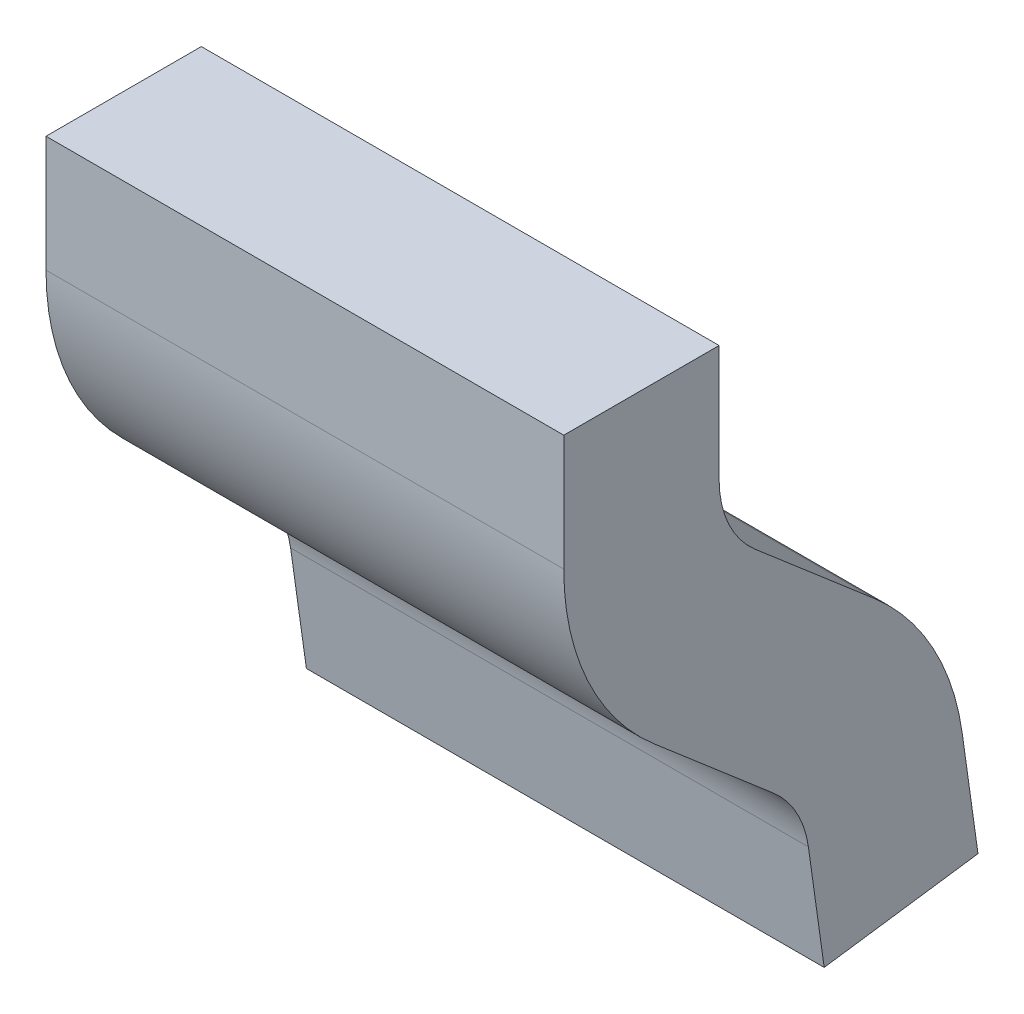
ISO-10303-21;
HEADER;
FILE_DESCRIPTION(('STEP AP214'),'2;1');
FILE_NAME('part.step','',(''),(''),'','','');
FILE_SCHEMA(('AUTOMOTIVE_DESIGN { 1 0 10303 214 1 1 1 1 }'));
ENDSEC;
DATA;
#1=APPLICATION_CONTEXT('core data for automotive mechanical design processes');
#2=APPLICATION_PROTOCOL_DEFINITION('international standard','automotive_design',2000,#1);
#3=PRODUCT_CONTEXT('',#1,'mechanical');
#4=PRODUCT('Part','Part','',(#3));
#5=PRODUCT_RELATED_PRODUCT_CATEGORY('part','',(#4));
#6=PRODUCT_DEFINITION_FORMATION('','',#4);
#7=PRODUCT_DEFINITION_CONTEXT('part definition',#1,'design');
#8=PRODUCT_DEFINITION('design','',#6,#7);
#9=PRODUCT_DEFINITION_SHAPE('','',#8);
#10=(LENGTH_UNIT() NAMED_UNIT(*) SI_UNIT(.MILLI.,.METRE.));
#11=(NAMED_UNIT(*) PLANE_ANGLE_UNIT() SI_UNIT($,.RADIAN.));
#12=(NAMED_UNIT(*) SI_UNIT($,.STERADIAN.) SOLID_ANGLE_UNIT());
#13=UNCERTAINTY_MEASURE_WITH_UNIT(LENGTH_MEASURE(1.E-05),#10,'distance_accuracy_value','');
#14=(GEOMETRIC_REPRESENTATION_CONTEXT(3) GLOBAL_UNCERTAINTY_ASSIGNED_CONTEXT((#13)) GLOBAL_UNIT_ASSIGNED_CONTEXT((#10,
#11,#12)) REPRESENTATION_CONTEXT('',''));
#15=CARTESIAN_POINT('',(0.,0.,0.));
#16=DIRECTION('',(0.,0.,1.));
#17=DIRECTION('',(1.,0.,0.));
#18=AXIS2_PLACEMENT_3D('',#15,#16,#17);
#19=CARTESIAN_POINT('',(0.5,-0.02087596514401,0.148540210311));
#20=DIRECTION('',(0.,0.990268068741588,0.139173100959942));
#21=DIRECTION('',(0.,-0.139173100959942,0.990268068741588));
#22=AXIS2_PLACEMENT_3D('',#19,#20,#21);
#23=PLANE('',#22);
#24=DIRECTION('',(0.,0.139173100960282,-0.99026806874154));
#25=VECTOR('',#24,1.);
#26=CARTESIAN_POINT('',(0.5,-0.02087596514401,0.148540210311));
#27=LINE('',#26,#25);
#28=CARTESIAN_POINT('',(0.5,-0.0208759651440416,0.148540210311224));
#29=VERTEX_POINT('',#28);
#30=CARTESIAN_POINT('',(0.5,0.,0.));
#31=VERTEX_POINT('',#30);
#32=EDGE_CURVE('E159',#29,#31,#27,.T.);
#33=ORIENTED_EDGE('',*,*,#32,.F.);
#34=DIRECTION('',(1.,0.,0.));
#35=VECTOR('',#34,1.);
#36=CARTESIAN_POINT('',(0.5,-0.0208759651441046,0.148540210311673));
#37=LINE('',#36,#35);
#38=CARTESIAN_POINT('',(0.,-0.0208759651440416,0.148540210311224));
#39=VERTEX_POINT('',#38);
#40=EDGE_CURVE('E109',#29,#39,#37,.F.);
#41=ORIENTED_EDGE('',*,*,#40,.T.);
#42=DIRECTION('',(0.,0.139173100960282,-0.99026806874154));
#43=VECTOR('',#42,1.);
#44=CARTESIAN_POINT('',(0.,-0.02087596514401,0.148540210311));
#45=LINE('',#44,#43);
#46=CARTESIAN_POINT('',(0.,0.,0.));
#47=VERTEX_POINT('',#46);
#48=EDGE_CURVE('E115',#39,#47,#45,.T.);
#49=ORIENTED_EDGE('',*,*,#48,.T.);
#50=DIRECTION('',(1.,0.,0.));
#51=VECTOR('',#50,1.);
#52=CARTESIAN_POINT('',(0.5,0.,0.));
#53=LINE('',#52,#51);
#54=EDGE_CURVE('E149',#47,#31,#53,.T.);
#55=ORIENTED_EDGE('',*,*,#54,.T.);
#56=EDGE_LOOP('',(#33,#41,#49,#55));
#57=FACE_BOUND('',#56,.T.);
#58=ADVANCED_FACE('F17',(#57),#23,.F.);
#59=CARTESIAN_POINT('',(0.5,0.,0.));
#60=DIRECTION('',(0.,-0.139173100959942,0.990268068741588));
#61=DIRECTION('',(0.,-0.990268068741588,-0.139173100959942));
#62=AXIS2_PLACEMENT_3D('',#59,#60,#61);
#63=PLANE('',#62);
#64=DIRECTION('',(0.,0.990268068741645,0.139173100959538));
#65=VECTOR('',#64,1.);
#66=CARTESIAN_POINT('',(0.5,0.,0.));
#67=LINE('',#66,#65);
#68=CARTESIAN_POINT('',(0.5,0.108466835632712,0.0152440196174594));
#69=VERTEX_POINT('',#68);
#70=EDGE_CURVE('E162',#31,#69,#67,.T.);
#71=ORIENTED_EDGE('',*,*,#70,.F.);
#72=ORIENTED_EDGE('',*,*,#54,.F.);
#73=DIRECTION('',(0.,0.990268068741645,0.139173100959538));
#74=VECTOR('',#73,1.);
#75=CARTESIAN_POINT('',(0.,0.,0.));
#76=LINE('',#75,#74);
#77=CARTESIAN_POINT('',(0.,0.108466835632712,0.0152440196174594));
#78=VERTEX_POINT('',#77);
#79=EDGE_CURVE('E118',#47,#78,#76,.T.);
#80=ORIENTED_EDGE('',*,*,#79,.T.);
#81=DIRECTION('',(-1.,0.,0.));
#82=VECTOR('',#81,1.);
#83=CARTESIAN_POINT('',(0.5,0.108466835632953,0.0152440196176632));
#84=LINE('',#83,#82);
#85=EDGE_CURVE('E146',#69,#78,#84,.T.);
#86=ORIENTED_EDGE('',*,*,#85,.F.);
#87=EDGE_LOOP('',(#71,#72,#80,#86));
#88=FACE_BOUND('',#87,.T.);
#89=ADVANCED_FACE('F206',(#88),#63,.F.);
#90=CARTESIAN_POINT('',(0.5,0.07367356039254,0.262811036803));
#91=DIRECTION('',(-1.,0.,0.));
#92=DIRECTION('',(0.,0.,1.));
#93=AXIS2_PLACEMENT_3D('',#90,#91,#92);
#94=CYLINDRICAL_SURFACE('',#93,0.25);
#95=CARTESIAN_POINT('',(0.,0.07367356039254,0.262811036803));
#96=DIRECTION('',(-1.,0.,0.));
#97=DIRECTION('',(0.,0.,1.));
#98=AXIS2_PLACEMENT_3D('',#95,#96,#97);
#99=CIRCLE('',#98,0.25);
#100=CARTESIAN_POINT('',(0.,0.263443889430082,0.100062082222095));
#101=VERTEX_POINT('',#100);
#102=EDGE_CURVE('E173',#78,#101,#99,.F.);
#103=ORIENTED_EDGE('',*,*,#102,.T.);
#104=DIRECTION('',(1.,0.,0.));
#105=VECTOR('',#104,1.);
#106=CARTESIAN_POINT('',(0.5,0.26344388943,0.100062082222));
#107=LINE('',#106,#105);
#108=CARTESIAN_POINT('',(0.5,0.263443889430082,0.100062082222095));
#109=VERTEX_POINT('',#108);
#110=EDGE_CURVE('E144',#101,#109,#107,.T.);
#111=ORIENTED_EDGE('',*,*,#110,.T.);
#112=CARTESIAN_POINT('',(0.5,0.07367356039254,0.262811036803));
#113=DIRECTION('',(-1.,0.,0.));
#114=DIRECTION('',(0.,0.,1.));
#115=AXIS2_PLACEMENT_3D('',#112,#113,#114);
#116=CIRCLE('',#115,0.25);
#117=EDGE_CURVE('E178',#69,#109,#116,.F.);
#118=ORIENTED_EDGE('',*,*,#117,.F.);
#119=ORIENTED_EDGE('',*,*,#85,.T.);
#120=EDGE_LOOP('',(#103,#111,#118,#119));
#121=FACE_BOUND('',#120,.T.);
#122=ADVANCED_FACE('F209',(#121),#94,.T.);
#123=CARTESIAN_POINT('',(0.5,0.26344388943,0.100062082222));
#124=DIRECTION('',(0.,-0.759081316148799,0.650995818322827));
#125=DIRECTION('',(0.,-0.650995818322827,-0.759081316148799));
#126=AXIS2_PLACEMENT_3D('',#123,#124,#125);
#127=PLANE('',#126);
#128=DIRECTION('',(0.,0.650995818322227,0.759081316149314));
#129=VECTOR('',#128,1.);
#130=CARTESIAN_POINT('',(0.5,0.26344388943,0.100062082222));
#131=LINE('',#130,#129);
#132=CARTESIAN_POINT('',(0.5,0.362101213228034,0.215099581832111));
#133=VERTEX_POINT('',#132);
#134=EDGE_CURVE('E177',#109,#133,#131,.T.);
#135=ORIENTED_EDGE('',*,*,#134,.F.);
#136=ORIENTED_EDGE('',*,*,#110,.F.);
#137=DIRECTION('',(0.,0.650995818322227,0.759081316149314));
#138=VECTOR('',#137,1.);
#139=CARTESIAN_POINT('',(0.,0.26344388943,0.100062082222));
#140=LINE('',#139,#138);
#141=CARTESIAN_POINT('',(0.,0.362101213228034,0.215099581832111));
#142=VERTEX_POINT('',#141);
#143=EDGE_CURVE('E172',#101,#142,#140,.T.);
#144=ORIENTED_EDGE('',*,*,#143,.T.);
#145=DIRECTION('',(-1.,0.,0.));
#146=VECTOR('',#145,1.);
#147=CARTESIAN_POINT('',(0.5,0.36210121322793,0.21509958183206));
#148=LINE('',#147,#146);
#149=EDGE_CURVE('E142',#142,#133,#148,.F.);
#150=ORIENTED_EDGE('',*,*,#149,.T.);
#151=EDGE_LOOP('',(#135,#136,#144,#150));
#152=FACE_BOUND('',#151,.T.);
#153=ADVANCED_FACE('F214',(#152),#127,.F.);
#154=CARTESIAN_POINT('',(0.5,0.438009344843,0.15));
#155=DIRECTION('',(-1.,0.,0.));
#156=DIRECTION('',(0.,0.,1.));
#157=AXIS2_PLACEMENT_3D('',#154,#155,#156);
#158=CYLINDRICAL_SURFACE('',#157,0.1);
#159=CARTESIAN_POINT('',(0.5,0.438009344843,0.15));
#160=DIRECTION('',(-1.,0.,0.));
#161=DIRECTION('',(0.,0.,1.));
#162=AXIS2_PLACEMENT_3D('',#159,#160,#161);
#163=CIRCLE('',#162,0.1);
#164=CARTESIAN_POINT('',(0.5,0.438009344843,0.25));
#165=VERTEX_POINT('',#164);
#166=EDGE_CURVE('E175',#133,#165,#163,.T.);
#167=ORIENTED_EDGE('',*,*,#166,.F.);
#168=ORIENTED_EDGE('',*,*,#149,.F.);
#169=CARTESIAN_POINT('',(0.,0.438009344843,0.15));
#170=DIRECTION('',(-1.,0.,0.));
#171=DIRECTION('',(0.,0.,1.));
#172=AXIS2_PLACEMENT_3D('',#169,#170,#171);
#173=CIRCLE('',#172,0.1);
#174=CARTESIAN_POINT('',(0.,0.438009344843,0.25));
#175=VERTEX_POINT('',#174);
#176=EDGE_CURVE('E170',#142,#175,#173,.T.);
#177=ORIENTED_EDGE('',*,*,#176,.T.);
#178=DIRECTION('',(1.,0.,0.));
#179=VECTOR('',#178,1.);
#180=CARTESIAN_POINT('',(0.5,0.438009344843,0.25));
#181=LINE('',#180,#179);
#182=EDGE_CURVE('E138',#175,#165,#181,.T.);
#183=ORIENTED_EDGE('',*,*,#182,.T.);
#184=EDGE_LOOP('',(#167,#168,#177,#183));
#185=FACE_BOUND('',#184,.T.);
#186=ADVANCED_FACE('F220',(#185),#158,.F.);
#187=CARTESIAN_POINT('',(0.5,0.438009344843,0.25));
#188=DIRECTION('',(0.,0.,1.));
#189=DIRECTION('',(1.,0.,0.));
#190=AXIS2_PLACEMENT_3D('',#187,#188,#189);
#191=PLANE('',#190);
#192=DIRECTION('',(0.,1.,0.));
#193=VECTOR('',#192,1.);
#194=CARTESIAN_POINT('',(0.5,0.07367356039254,0.25));
#195=LINE('',#194,#193);
#196=CARTESIAN_POINT('',(0.5,0.55,0.25));
#197=VERTEX_POINT('',#196);
#198=EDGE_CURVE('E156',#165,#197,#195,.T.);
#199=ORIENTED_EDGE('',*,*,#198,.F.);
#200=ORIENTED_EDGE('',*,*,#182,.F.);
#201=DIRECTION('',(0.,1.,0.));
#202=VECTOR('',#201,1.);
#203=CARTESIAN_POINT('',(0.,0.07367356039254,0.25));
#204=LINE('',#203,#202);
#205=CARTESIAN_POINT('',(0.,0.55,0.25));
#206=VERTEX_POINT('',#205);
#207=EDGE_CURVE('E133',#175,#206,#204,.T.);
#208=ORIENTED_EDGE('',*,*,#207,.T.);
#209=DIRECTION('',(1.,0.,0.));
#210=VECTOR('',#209,1.);
#211=CARTESIAN_POINT('',(0.5,0.55,0.25));
#212=LINE('',#211,#210);
#213=EDGE_CURVE('E112',#206,#197,#212,.T.);
#214=ORIENTED_EDGE('',*,*,#213,.T.);
#215=EDGE_LOOP('',(#199,#200,#208,#214));
#216=FACE_BOUND('',#215,.T.);
#217=ADVANCED_FACE('F226',(#216),#191,.F.);
#218=CARTESIAN_POINT('',(0.5,0.55,0.25));
#219=DIRECTION('',(0.,-1.,0.));
#220=DIRECTION('',(0.,0.,-1.));
#221=AXIS2_PLACEMENT_3D('',#218,#219,#220);
#222=PLANE('',#221);
#223=DIRECTION('',(0.,0.,-1.));
#224=VECTOR('',#223,1.);
#225=CARTESIAN_POINT('',(0.5,0.55,0.262811036803));
#226=LINE('',#225,#224);
#227=CARTESIAN_POINT('',(0.5,0.55,0.4));
#228=VERTEX_POINT('',#227);
#229=EDGE_CURVE('E126',#197,#228,#226,.F.);
#230=ORIENTED_EDGE('',*,*,#229,.F.);
#231=ORIENTED_EDGE('',*,*,#213,.F.);
#232=DIRECTION('',(0.,0.,-1.));
#233=VECTOR('',#232,1.);
#234=CARTESIAN_POINT('',(0.,0.55,0.262811036803));
#235=LINE('',#234,#233);
#236=CARTESIAN_POINT('',(0.,0.55,0.4));
#237=VERTEX_POINT('',#236);
#238=EDGE_CURVE('E129',#206,#237,#235,.F.);
#239=ORIENTED_EDGE('',*,*,#238,.T.);
#240=DIRECTION('',(-1.,0.,0.));
#241=VECTOR('',#240,1.);
#242=CARTESIAN_POINT('',(0.5,0.55,0.4));
#243=LINE('',#242,#241);
#244=EDGE_CURVE('E123',#237,#228,#243,.F.);
#245=ORIENTED_EDGE('',*,*,#244,.T.);
#246=EDGE_LOOP('',(#230,#231,#239,#245));
#247=FACE_BOUND('',#246,.T.);
#248=ADVANCED_FACE('F278',(#247),#222,.F.);
#249=CARTESIAN_POINT('',(0.5,0.08759087048855,0.163784229929));
#250=DIRECTION('',(0.,0.139173100959942,-0.990268068741588));
#251=DIRECTION('',(0.,0.990268068741588,0.139173100959942));
#252=AXIS2_PLACEMENT_3D('',#249,#250,#251);
#253=PLANE('',#252);
#254=DIRECTION('',(0.,-0.990268068740724,-0.13917310096609));
#255=VECTOR('',#254,1.);
#256=CARTESIAN_POINT('',(0.5,0.08759087048855,0.163784229929));
#257=LINE('',#256,#255);
#258=CARTESIAN_POINT('',(0.5,0.0875908704888495,0.163784229928964));
#259=VERTEX_POINT('',#258);
#260=EDGE_CURVE('E95',#259,#29,#257,.T.);
#261=ORIENTED_EDGE('',*,*,#260,.F.);
#262=DIRECTION('',(-1.,0.,0.));
#263=VECTOR('',#262,1.);
#264=CARTESIAN_POINT('',(0.5,0.0875908704885716,0.163784229928846));
#265=LINE('',#264,#263);
#266=CARTESIAN_POINT('',(0.,0.0875908704888495,0.163784229928964));
#267=VERTEX_POINT('',#266);
#268=EDGE_CURVE('E91',#259,#267,#265,.T.);
#269=ORIENTED_EDGE('',*,*,#268,.T.);
#270=DIRECTION('',(0.,-0.990268068740724,-0.13917310096609));
#271=VECTOR('',#270,1.);
#272=CARTESIAN_POINT('',(0.,0.08759087048855,0.163784229929));
#273=LINE('',#272,#271);
#274=EDGE_CURVE('E169',#267,#39,#273,.T.);
#275=ORIENTED_EDGE('',*,*,#274,.T.);
#276=ORIENTED_EDGE('',*,*,#40,.F.);
#277=EDGE_LOOP('',(#261,#269,#275,#276));
#278=FACE_BOUND('',#277,.T.);
#279=ADVANCED_FACE('F196',(#278),#253,.F.);
#280=CARTESIAN_POINT('',(0.5,0.07367356039254,0.262811036803));
#281=DIRECTION('',(-1.,0.,0.));
#282=DIRECTION('',(0.,0.,1.));
#283=AXIS2_PLACEMENT_3D('',#280,#281,#282);
#284=CYLINDRICAL_SURFACE('',#283,0.1);
#285=CARTESIAN_POINT('',(0.5,0.07367356039254,0.262811036803));
#286=DIRECTION('',(-1.,0.,0.));
#287=DIRECTION('',(0.,0.,1.));
#288=AXIS2_PLACEMENT_3D('',#285,#286,#287);
#289=CIRCLE('',#288,0.1);
#290=CARTESIAN_POINT('',(0.5,0.149581692007257,0.197711454970318));
#291=VERTEX_POINT('',#290);
#292=EDGE_CURVE('E20',#291,#259,#289,.T.);
#293=ORIENTED_EDGE('',*,*,#292,.F.);
#294=DIRECTION('',(1.,0.,0.));
#295=VECTOR('',#294,1.);
#296=CARTESIAN_POINT('',(0.5,0.149581692006991,0.197711454970008));
#297=LINE('',#296,#295);
#298=CARTESIAN_POINT('',(0.,0.149581692007257,0.197711454970318));
#299=VERTEX_POINT('',#298);
#300=EDGE_CURVE('E90',#291,#299,#297,.F.);
#301=ORIENTED_EDGE('',*,*,#300,.T.);
#302=CARTESIAN_POINT('',(0.,0.07367356039254,0.262811036803));
#303=DIRECTION('',(-1.,0.,0.));
#304=DIRECTION('',(0.,0.,1.));
#305=AXIS2_PLACEMENT_3D('',#302,#303,#304);
#306=CIRCLE('',#305,0.1);
#307=EDGE_CURVE('E167',#299,#267,#306,.T.);
#308=ORIENTED_EDGE('',*,*,#307,.T.);
#309=ORIENTED_EDGE('',*,*,#268,.F.);
#310=EDGE_LOOP('',(#293,#301,#308,#309));
#311=FACE_BOUND('',#310,.T.);
#312=ADVANCED_FACE('F87',(#311),#284,.F.);
#313=CARTESIAN_POINT('',(0.5,0.07367356039254,0.262811036803));
#314=DIRECTION('',(1.,0.,0.));
#315=DIRECTION('',(0.,0.,-1.));
#316=AXIS2_PLACEMENT_3D('',#313,#314,#315);
#317=PLANE('',#316);
#318=CARTESIAN_POINT('',(0.5,0.438009344843,0.15));
#319=DIRECTION('',(-1.,0.,0.));
#320=DIRECTION('',(0.,0.,1.));
#321=AXIS2_PLACEMENT_3D('',#318,#319,#320);
#322=CIRCLE('',#321,0.25);
#323=CARTESIAN_POINT('',(0.5,0.2482390158059,0.312748954580853));
#324=VERTEX_POINT('',#323);
#325=CARTESIAN_POINT('',(0.5,0.438009344843,0.4));
#326=VERTEX_POINT('',#325);
#327=EDGE_CURVE('E100',#324,#326,#322,.T.);
#328=ORIENTED_EDGE('',*,*,#327,.F.);
#329=DIRECTION('',(0.,0.650995818322827,0.759081316148799));
#330=VECTOR('',#329,1.);
#331=CARTESIAN_POINT('',(0.5,0.248239015806,0.312748954581));
#332=LINE('',#331,#330);
#333=EDGE_CURVE('E97',#324,#291,#332,.F.);
#334=ORIENTED_EDGE('',*,*,#333,.T.);
#335=ORIENTED_EDGE('',*,*,#292,.T.);
#336=ORIENTED_EDGE('',*,*,#260,.T.);
#337=ORIENTED_EDGE('',*,*,#32,.T.);
#338=ORIENTED_EDGE('',*,*,#70,.T.);
#339=ORIENTED_EDGE('',*,*,#117,.T.);
#340=ORIENTED_EDGE('',*,*,#134,.T.);
#341=ORIENTED_EDGE('',*,*,#166,.T.);
#342=ORIENTED_EDGE('',*,*,#198,.T.);
#343=ORIENTED_EDGE('',*,*,#229,.T.);
#344=DIRECTION('',(0.,1.,0.));
#345=VECTOR('',#344,1.);
#346=CARTESIAN_POINT('',(0.5,0.55,0.4));
#347=LINE('',#346,#345);
#348=EDGE_CURVE('E119',#228,#326,#347,.F.);
#349=ORIENTED_EDGE('',*,*,#348,.T.);
#350=EDGE_LOOP('',(#328,#334,#335,#336,#337,#338,#339,#340,#341,#342,#343,#349));
#351=FACE_BOUND('',#350,.T.);
#352=ADVANCED_FACE('F98',(#351),#317,.T.);
#353=CARTESIAN_POINT('',(0.5,0.55,0.4));
#354=DIRECTION('',(0.,0.,-1.));
#355=DIRECTION('',(-1.,0.,0.));
#356=AXIS2_PLACEMENT_3D('',#353,#354,#355);
#357=PLANE('',#356);
#358=ORIENTED_EDGE('',*,*,#348,.F.);
#359=ORIENTED_EDGE('',*,*,#244,.F.);
#360=DIRECTION('',(0.,1.,0.));
#361=VECTOR('',#360,1.);
#362=CARTESIAN_POINT('',(0.,0.07367356039254,0.4));
#363=LINE('',#362,#361);
#364=CARTESIAN_POINT('',(0.,0.438009344843,0.4));
#365=VERTEX_POINT('',#364);
#366=EDGE_CURVE('E132',#237,#365,#363,.F.);
#367=ORIENTED_EDGE('',*,*,#366,.T.);
#368=DIRECTION('',(-1.,0.,0.));
#369=VECTOR('',#368,1.);
#370=CARTESIAN_POINT('',(0.5,0.438009344843,0.4));
#371=LINE('',#370,#369);
#372=EDGE_CURVE('E105',#326,#365,#371,.T.);
#373=ORIENTED_EDGE('',*,*,#372,.F.);
#374=EDGE_LOOP('',(#358,#359,#367,#373));
#375=FACE_BOUND('',#374,.T.);
#376=ADVANCED_FACE('F255',(#375),#357,.F.);
#377=CARTESIAN_POINT('',(0.,0.07367356039254,0.262811036803));
#378=DIRECTION('',(1.,0.,0.));
#379=DIRECTION('',(0.,0.,-1.));
#380=AXIS2_PLACEMENT_3D('',#377,#378,#379);
#381=PLANE('',#380);
#382=ORIENTED_EDGE('',*,*,#307,.F.);
#383=DIRECTION('',(0.,0.650995818322827,0.759081316148799));
#384=VECTOR('',#383,1.);
#385=CARTESIAN_POINT('',(0.,0.248239015806,0.312748954581));
#386=LINE('',#385,#384);
#387=CARTESIAN_POINT('',(0.,0.2482390158059,0.312748954580853));
#388=VERTEX_POINT('',#387);
#389=EDGE_CURVE('E35',#299,#388,#386,.T.);
#390=ORIENTED_EDGE('',*,*,#389,.T.);
#391=CARTESIAN_POINT('',(0.,0.438009344843,0.15));
#392=DIRECTION('',(-1.,0.,0.));
#393=DIRECTION('',(0.,0.,1.));
#394=AXIS2_PLACEMENT_3D('',#391,#392,#393);
#395=CIRCLE('',#394,0.25);
#396=EDGE_CURVE('E26',#365,#388,#395,.F.);
#397=ORIENTED_EDGE('',*,*,#396,.F.);
#398=ORIENTED_EDGE('',*,*,#366,.F.);
#399=ORIENTED_EDGE('',*,*,#238,.F.);
#400=ORIENTED_EDGE('',*,*,#207,.F.);
#401=ORIENTED_EDGE('',*,*,#176,.F.);
#402=ORIENTED_EDGE('',*,*,#143,.F.);
#403=ORIENTED_EDGE('',*,*,#102,.F.);
#404=ORIENTED_EDGE('',*,*,#79,.F.);
#405=ORIENTED_EDGE('',*,*,#48,.F.);
#406=ORIENTED_EDGE('',*,*,#274,.F.);
#407=EDGE_LOOP('',(#382,#390,#397,#398,#399,#400,#401,#402,#403,#404,#405,#406));
#408=FACE_BOUND('',#407,.T.);
#409=ADVANCED_FACE('F257',(#408),#381,.F.);
#410=CARTESIAN_POINT('',(0.5,0.248239015806,0.312748954581));
#411=DIRECTION('',(0.,0.759081316148799,-0.650995818322827));
#412=DIRECTION('',(0.,0.650995818322827,0.759081316148799));
#413=AXIS2_PLACEMENT_3D('',#410,#411,#412);
#414=PLANE('',#413);
#415=ORIENTED_EDGE('',*,*,#333,.F.);
#416=DIRECTION('',(-1.,0.,0.));
#417=VECTOR('',#416,1.);
#418=CARTESIAN_POINT('',(0.5,0.24823901580603,0.312748954580974));
#419=LINE('',#418,#417);
#420=EDGE_CURVE('E11',#388,#324,#419,.F.);
#421=ORIENTED_EDGE('',*,*,#420,.F.);
#422=ORIENTED_EDGE('',*,*,#389,.F.);
#423=ORIENTED_EDGE('',*,*,#300,.F.);
#424=EDGE_LOOP('',(#415,#421,#422,#423));
#425=FACE_BOUND('',#424,.T.);
#426=ADVANCED_FACE('F103',(#425),#414,.F.);
#427=CARTESIAN_POINT('',(0.5,0.438009344843,0.15));
#428=DIRECTION('',(-1.,0.,0.));
#429=DIRECTION('',(0.,0.,1.));
#430=AXIS2_PLACEMENT_3D('',#427,#428,#429);
#431=CYLINDRICAL_SURFACE('',#430,0.25);
#432=ORIENTED_EDGE('',*,*,#396,.T.);
#433=ORIENTED_EDGE('',*,*,#420,.T.);
#434=ORIENTED_EDGE('',*,*,#327,.T.);
#435=ORIENTED_EDGE('',*,*,#372,.T.);
#436=EDGE_LOOP('',(#432,#433,#434,#435));
#437=FACE_BOUND('',#436,.T.);
#438=ADVANCED_FACE('F259',(#437),#431,.T.);
#439=CLOSED_SHELL('',(#58,#89,#122,#153,#186,#217,#248,#279,#312,#352,#376,#409,#426,#438));
#440=MANIFOLD_SOLID_BREP('B1',#439);
#441=ADVANCED_BREP_SHAPE_REPRESENTATION('',(#18,#440),#14);
#442=SHAPE_DEFINITION_REPRESENTATION(#9,#441);
ENDSEC;
END-ISO-10303-21;
